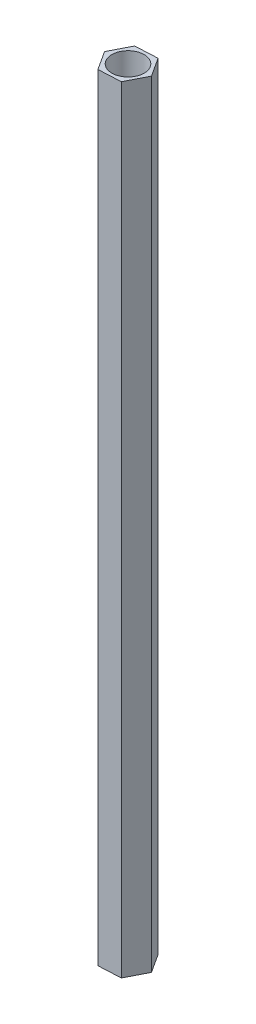
ISO-10303-21;
HEADER;
FILE_DESCRIPTION(('STEP AP214'),'2;1');
FILE_NAME('part.step','',(''),(''),'','','');
FILE_SCHEMA(('AUTOMOTIVE_DESIGN { 1 0 10303 214 1 1 1 1 }'));
ENDSEC;
DATA;
#1=APPLICATION_CONTEXT('core data for automotive mechanical design processes');
#2=APPLICATION_PROTOCOL_DEFINITION('international standard','automotive_design',2000,#1);
#3=PRODUCT_CONTEXT('',#1,'mechanical');
#4=PRODUCT('Part','Part','',(#3));
#5=PRODUCT_RELATED_PRODUCT_CATEGORY('part','',(#4));
#6=PRODUCT_DEFINITION_FORMATION('','',#4);
#7=PRODUCT_DEFINITION_CONTEXT('part definition',#1,'design');
#8=PRODUCT_DEFINITION('design','',#6,#7);
#9=PRODUCT_DEFINITION_SHAPE('','',#8);
#10=(LENGTH_UNIT() NAMED_UNIT(*) SI_UNIT(.MILLI.,.METRE.));
#11=(NAMED_UNIT(*) PLANE_ANGLE_UNIT() SI_UNIT($,.RADIAN.));
#12=(NAMED_UNIT(*) SI_UNIT($,.STERADIAN.) SOLID_ANGLE_UNIT());
#13=UNCERTAINTY_MEASURE_WITH_UNIT(LENGTH_MEASURE(1.E-05),#10,'distance_accuracy_value','');
#14=(GEOMETRIC_REPRESENTATION_CONTEXT(3) GLOBAL_UNCERTAINTY_ASSIGNED_CONTEXT((#13)) GLOBAL_UNIT_ASSIGNED_CONTEXT((#10,
#11,#12)) REPRESENTATION_CONTEXT('',''));
#15=CARTESIAN_POINT('',(0.,0.,0.));
#16=DIRECTION('',(0.,0.,1.));
#17=DIRECTION('',(1.,0.,0.));
#18=AXIS2_PLACEMENT_3D('',#15,#16,#17);
#19=CARTESIAN_POINT('',(-0.788885828205648,55.63,1.54196600158897));
#20=DIRECTION('',(-0.0506843289464987,0.,-0.998714723431693));
#21=DIRECTION('',(-0.998714723431693,0.,0.0506843289464987));
#22=AXIS2_PLACEMENT_3D('',#19,#20,#21);
#23=PLANE('',#22);
#24=DIRECTION('',(0.998714723431693,0.,-0.0506843289464987));
#25=VECTOR('',#24,1.);
#26=CARTESIAN_POINT('',(-0.788885828205648,0.,1.54196600158897));
#27=LINE('',#26,#25);
#28=CARTESIAN_POINT('',(-0.788885828205648,0.,1.54196600158897));
#29=VERTEX_POINT('',#28);
#30=CARTESIAN_POINT('',(0.940938815045143,0.,1.4541781687061));
#31=VERTEX_POINT('',#30);
#32=EDGE_CURVE('E131',#29,#31,#27,.T.);
#33=ORIENTED_EDGE('',*,*,#32,.T.);
#34=DIRECTION('',(0.,-1.,0.));
#35=VECTOR('',#34,1.);
#36=CARTESIAN_POINT('',(0.940938815045143,55.63,1.4541781687061));
#37=LINE('',#36,#35);
#38=CARTESIAN_POINT('',(0.940938815045159,60.120261179749,1.45417816870609));
#39=VERTEX_POINT('',#38);
#40=EDGE_CURVE('E11',#39,#31,#37,.T.);
#41=ORIENTED_EDGE('',*,*,#40,.F.);
#42=DIRECTION('',(0.998714723431692,0.,-0.0506843289465091));
#43=VECTOR('',#42,1.);
#44=CARTESIAN_POINT('',(-0.788885828205631,60.120261179749,1.54196600158898));
#45=LINE('',#44,#43);
#46=CARTESIAN_POINT('',(-0.788885828205631,60.120261179749,1.54196600158898));
#47=VERTEX_POINT('',#46);
#48=EDGE_CURVE('E125',#47,#39,#45,.T.);
#49=ORIENTED_EDGE('',*,*,#48,.F.);
#50=DIRECTION('',(0.,-1.,0.));
#51=VECTOR('',#50,1.);
#52=CARTESIAN_POINT('',(-0.788885828205648,55.63,1.54196600158897));
#53=LINE('',#52,#51);
#54=EDGE_CURVE('E141',#47,#29,#53,.T.);
#55=ORIENTED_EDGE('',*,*,#54,.T.);
#56=EDGE_LOOP('',(#33,#41,#49,#55));
#57=FACE_BOUND('',#56,.T.);
#58=ADVANCED_FACE('F37',(#57),#23,.F.);
#59=CARTESIAN_POINT('',(0.940938815045143,55.63,1.4541781687061));
#60=DIRECTION('',(-0.890254486098645,0.,-0.455463445274412));
#61=DIRECTION('',(-0.455463445274412,0.,0.890254486098645));
#62=AXIS2_PLACEMENT_3D('',#59,#60,#61);
#63=PLANE('',#62);
#64=DIRECTION('',(0.455463445274412,0.,-0.890254486098645));
#65=VECTOR('',#64,1.);
#66=CARTESIAN_POINT('',(0.940938815045143,0.,1.4541781687061));
#67=LINE('',#66,#65);
#68=CARTESIAN_POINT('',(1.72982464325079,0.,-0.0877878328828703));
#69=VERTEX_POINT('',#68);
#70=EDGE_CURVE('E134',#31,#69,#67,.T.);
#71=ORIENTED_EDGE('',*,*,#70,.T.);
#72=DIRECTION('',(0.,-1.,0.));
#73=VECTOR('',#72,1.);
#74=CARTESIAN_POINT('',(1.72982464325079,55.63,-0.0877878328828703));
#75=LINE('',#74,#73);
#76=CARTESIAN_POINT('',(1.72982464325079,60.120261179749,-0.0877878328828878));
#77=VERTEX_POINT('',#76);
#78=EDGE_CURVE('E44',#77,#69,#75,.T.);
#79=ORIENTED_EDGE('',*,*,#78,.F.);
#80=DIRECTION('',(0.455463445274402,0.,-0.89025448609865));
#81=VECTOR('',#80,1.);
#82=CARTESIAN_POINT('',(0.940938815045159,60.120261179749,1.45417816870609));
#83=LINE('',#82,#81);
#84=EDGE_CURVE('E115',#39,#77,#83,.T.);
#85=ORIENTED_EDGE('',*,*,#84,.F.);
#86=ORIENTED_EDGE('',*,*,#40,.T.);
#87=EDGE_LOOP('',(#71,#79,#85,#86));
#88=FACE_BOUND('',#87,.T.);
#89=ADVANCED_FACE('F154',(#88),#63,.F.);
#90=CARTESIAN_POINT('',(1.72982464325079,55.63,-0.0877878328828703));
#91=DIRECTION('',(-0.839570157152146,0.,0.543251278157282));
#92=DIRECTION('',(0.543251278157282,0.,0.839570157152146));
#93=AXIS2_PLACEMENT_3D('',#90,#91,#92);
#94=PLANE('',#93);
#95=DIRECTION('',(-0.543251278157282,0.,-0.839570157152146));
#96=VECTOR('',#95,1.);
#97=CARTESIAN_POINT('',(1.72982464325079,0.,-0.0877878328828703));
#98=LINE('',#97,#96);
#99=CARTESIAN_POINT('',(0.788885828205648,0.,-1.54196600158897));
#100=VERTEX_POINT('',#99);
#101=EDGE_CURVE('E97',#69,#100,#98,.T.);
#102=ORIENTED_EDGE('',*,*,#101,.T.);
#103=DIRECTION('',(0.,-1.,0.));
#104=VECTOR('',#103,1.);
#105=CARTESIAN_POINT('',(0.788885828205648,55.63,-1.54196600158897));
#106=LINE('',#105,#104);
#107=CARTESIAN_POINT('',(0.788885828205632,60.120261179749,-1.54196600158898));
#108=VERTEX_POINT('',#107);
#109=EDGE_CURVE('E90',#108,#100,#106,.T.);
#110=ORIENTED_EDGE('',*,*,#109,.F.);
#111=DIRECTION('',(-0.54325127815729,0.,-0.839570157152141));
#112=VECTOR('',#111,1.);
#113=CARTESIAN_POINT('',(1.72982464325079,60.120261179749,-0.0877878328828878));
#114=LINE('',#113,#112);
#115=EDGE_CURVE('E95',#77,#108,#114,.T.);
#116=ORIENTED_EDGE('',*,*,#115,.F.);
#117=ORIENTED_EDGE('',*,*,#78,.T.);
#118=EDGE_LOOP('',(#102,#110,#116,#117));
#119=FACE_BOUND('',#118,.T.);
#120=ADVANCED_FACE('F92',(#119),#94,.F.);
#121=CARTESIAN_POINT('',(0.788885828205648,55.63,-1.54196600158897));
#122=DIRECTION('',(0.0506843289464987,0.,0.998714723431693));
#123=DIRECTION('',(0.998714723431693,0.,-0.0506843289464987));
#124=AXIS2_PLACEMENT_3D('',#121,#122,#123);
#125=PLANE('',#124);
#126=DIRECTION('',(-0.998714723431693,0.,0.0506843289464987));
#127=VECTOR('',#126,1.);
#128=CARTESIAN_POINT('',(0.788885828205648,0.,-1.54196600158897));
#129=LINE('',#128,#127);
#130=CARTESIAN_POINT('',(-0.940938815045144,0.,-1.45417816870611));
#131=VERTEX_POINT('',#130);
#132=EDGE_CURVE('E137',#100,#131,#129,.T.);
#133=ORIENTED_EDGE('',*,*,#132,.T.);
#134=DIRECTION('',(0.,-1.,0.));
#135=VECTOR('',#134,1.);
#136=CARTESIAN_POINT('',(-0.940938815045144,55.63,-1.45417816870611));
#137=LINE('',#136,#135);
#138=CARTESIAN_POINT('',(-0.940938815045158,60.120261179749,-1.45417816870609));
#139=VERTEX_POINT('',#138);
#140=EDGE_CURVE('E100',#139,#131,#137,.T.);
#141=ORIENTED_EDGE('',*,*,#140,.F.);
#142=DIRECTION('',(-0.998714723431693,0.,0.0506843289465087));
#143=VECTOR('',#142,1.);
#144=CARTESIAN_POINT('',(0.788885828205632,60.120261179749,-1.54196600158898));
#145=LINE('',#144,#143);
#146=EDGE_CURVE('E103',#108,#139,#145,.T.);
#147=ORIENTED_EDGE('',*,*,#146,.F.);
#148=ORIENTED_EDGE('',*,*,#109,.T.);
#149=EDGE_LOOP('',(#133,#141,#147,#148));
#150=FACE_BOUND('',#149,.T.);
#151=ADVANCED_FACE('F104',(#150),#125,.F.);
#152=CARTESIAN_POINT('',(-0.940938815045144,55.63,-1.45417816870611));
#153=DIRECTION('',(0.890254486098645,0.,0.455463445274412));
#154=DIRECTION('',(0.455463445274412,0.,-0.890254486098645));
#155=AXIS2_PLACEMENT_3D('',#152,#153,#154);
#156=PLANE('',#155);
#157=DIRECTION('',(-0.455463445274412,0.,0.890254486098645));
#158=VECTOR('',#157,1.);
#159=CARTESIAN_POINT('',(-0.940938815045144,0.,-1.45417816870611));
#160=LINE('',#159,#158);
#161=CARTESIAN_POINT('',(-1.72982464325079,0.,0.0877878328828701));
#162=VERTEX_POINT('',#161);
#163=EDGE_CURVE('E59',#131,#162,#160,.T.);
#164=ORIENTED_EDGE('',*,*,#163,.T.);
#165=DIRECTION('',(0.,-1.,0.));
#166=VECTOR('',#165,1.);
#167=CARTESIAN_POINT('',(-1.72982464325079,55.63,0.0877878328828701));
#168=LINE('',#167,#166);
#169=CARTESIAN_POINT('',(-1.72982464325079,60.120261179749,0.087787832882888));
#170=VERTEX_POINT('',#169);
#171=EDGE_CURVE('E143',#170,#162,#168,.T.);
#172=ORIENTED_EDGE('',*,*,#171,.F.);
#173=DIRECTION('',(-0.455463445274402,0.,0.89025448609865));
#174=VECTOR('',#173,1.);
#175=CARTESIAN_POINT('',(-0.940938815045158,60.120261179749,-1.45417816870609));
#176=LINE('',#175,#174);
#177=EDGE_CURVE('E108',#139,#170,#176,.T.);
#178=ORIENTED_EDGE('',*,*,#177,.F.);
#179=ORIENTED_EDGE('',*,*,#140,.T.);
#180=EDGE_LOOP('',(#164,#172,#178,#179));
#181=FACE_BOUND('',#180,.T.);
#182=ADVANCED_FACE('F149',(#181),#156,.F.);
#183=CARTESIAN_POINT('',(-1.72982464325079,55.63,0.0877878328828701));
#184=DIRECTION('',(0.839570157152147,0.,-0.543251278157281));
#185=DIRECTION('',(-0.543251278157281,0.,-0.839570157152147));
#186=AXIS2_PLACEMENT_3D('',#183,#184,#185);
#187=PLANE('',#186);
#188=DIRECTION('',(0.543251278157281,0.,0.839570157152147));
#189=VECTOR('',#188,1.);
#190=CARTESIAN_POINT('',(-1.72982464325079,0.,0.0877878328828701));
#191=LINE('',#190,#189);
#192=EDGE_CURVE('E51',#162,#29,#191,.T.);
#193=ORIENTED_EDGE('',*,*,#192,.T.);
#194=ORIENTED_EDGE('',*,*,#54,.F.);
#195=DIRECTION('',(0.54325127815729,0.,0.839570157152141));
#196=VECTOR('',#195,1.);
#197=CARTESIAN_POINT('',(-1.72982464325079,60.120261179749,0.087787832882888));
#198=LINE('',#197,#196);
#199=EDGE_CURVE('E122',#170,#47,#198,.T.);
#200=ORIENTED_EDGE('',*,*,#199,.F.);
#201=ORIENTED_EDGE('',*,*,#171,.T.);
#202=EDGE_LOOP('',(#193,#194,#200,#201));
#203=FACE_BOUND('',#202,.T.);
#204=ADVANCED_FACE('F152',(#203),#187,.F.);
#205=CARTESIAN_POINT('',(0.,0.,0.));
#206=DIRECTION('',(0.,1.,0.));
#207=DIRECTION('',(0.,0.,1.));
#208=AXIS2_PLACEMENT_3D('',#205,#206,#207);
#209=PLANE('',#208);
#210=CARTESIAN_POINT('',(0.,0.,0.));
#211=DIRECTION('',(0.,1.,0.));
#212=DIRECTION('',(0.,0.,1.));
#213=AXIS2_PLACEMENT_3D('',#210,#211,#212);
#214=CIRCLE('',#213,1.25);
#215=CARTESIAN_POINT('',(0.,0.,1.25));
#216=VERTEX_POINT('',#215);
#217=EDGE_CURVE('E128',#216,#216,#214,.T.);
#218=ORIENTED_EDGE('',*,*,#217,.T.);
#219=EDGE_LOOP('',(#218));
#220=FACE_BOUND('',#219,.T.);
#221=ORIENTED_EDGE('',*,*,#32,.F.);
#222=ORIENTED_EDGE('',*,*,#192,.F.);
#223=ORIENTED_EDGE('',*,*,#163,.F.);
#224=ORIENTED_EDGE('',*,*,#132,.F.);
#225=ORIENTED_EDGE('',*,*,#101,.F.);
#226=ORIENTED_EDGE('',*,*,#70,.F.);
#227=EDGE_LOOP('',(#221,#222,#223,#224,#225,#226));
#228=FACE_BOUND('',#227,.T.);
#229=ADVANCED_FACE('F148',(#220,#228),#209,.F.);
#230=CARTESIAN_POINT('',(0.,0.,0.));
#231=DIRECTION('',(0.,1.,0.));
#232=DIRECTION('',(0.,0.,1.));
#233=AXIS2_PLACEMENT_3D('',#230,#231,#232);
#234=CYLINDRICAL_SURFACE('',#233,1.25);
#235=ORIENTED_EDGE('',*,*,#217,.F.);
#236=EDGE_LOOP('',(#235));
#237=FACE_BOUND('',#236,.T.);
#238=CARTESIAN_POINT('',(0.,60.120261179749,0.));
#239=DIRECTION('',(0.,1.,0.));
#240=DIRECTION('',(0.,0.,1.));
#241=AXIS2_PLACEMENT_3D('',#238,#239,#240);
#242=CIRCLE('',#241,1.25);
#243=CARTESIAN_POINT('',(0.,60.120261179749,1.25));
#244=VERTEX_POINT('',#243);
#245=EDGE_CURVE('E116',#244,#244,#242,.T.);
#246=ORIENTED_EDGE('',*,*,#245,.T.);
#247=EDGE_LOOP('',(#246));
#248=FACE_BOUND('',#247,.T.);
#249=ADVANCED_FACE('F170',(#237,#248),#234,.F.);
#250=CARTESIAN_POINT('',(0.,60.120261179749,0.));
#251=DIRECTION('',(0.,1.,0.));
#252=DIRECTION('',(0.,0.,1.));
#253=AXIS2_PLACEMENT_3D('',#250,#251,#252);
#254=PLANE('',#253);
#255=ORIENTED_EDGE('',*,*,#115,.T.);
#256=ORIENTED_EDGE('',*,*,#146,.T.);
#257=ORIENTED_EDGE('',*,*,#177,.T.);
#258=ORIENTED_EDGE('',*,*,#199,.T.);
#259=ORIENTED_EDGE('',*,*,#48,.T.);
#260=ORIENTED_EDGE('',*,*,#84,.T.);
#261=EDGE_LOOP('',(#255,#256,#257,#258,#259,#260));
#262=FACE_BOUND('',#261,.T.);
#263=ORIENTED_EDGE('',*,*,#245,.F.);
#264=EDGE_LOOP('',(#263));
#265=FACE_BOUND('',#264,.T.);
#266=ADVANCED_FACE('F111',(#262,#265),#254,.T.);
#267=CLOSED_SHELL('',(#58,#89,#120,#151,#182,#204,#229,#249,#266));
#268=MANIFOLD_SOLID_BREP('B2',#267);
#269=ADVANCED_BREP_SHAPE_REPRESENTATION('',(#18,#268),#14);
#270=SHAPE_DEFINITION_REPRESENTATION(#9,#269);
ENDSEC;
END-ISO-10303-21;
